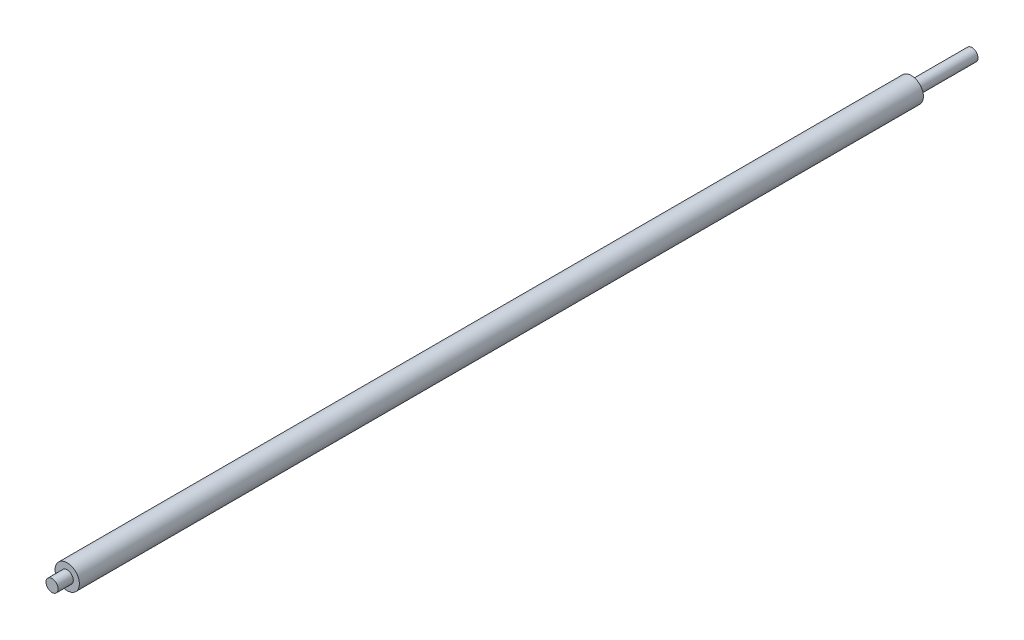
ISO-10303-21;
HEADER;
FILE_DESCRIPTION(('STEP AP214'),'2;1');
FILE_NAME('part.step','',(''),(''),'','','');
FILE_SCHEMA(('AUTOMOTIVE_DESIGN { 1 0 10303 214 1 1 1 1 }'));
ENDSEC;
DATA;
#1=APPLICATION_CONTEXT('core data for automotive mechanical design processes');
#2=APPLICATION_PROTOCOL_DEFINITION('international standard','automotive_design',2000,#1);
#3=PRODUCT_CONTEXT('',#1,'mechanical');
#4=PRODUCT('Part','Part','',(#3));
#5=PRODUCT_RELATED_PRODUCT_CATEGORY('part','',(#4));
#6=PRODUCT_DEFINITION_FORMATION('','',#4);
#7=PRODUCT_DEFINITION_CONTEXT('part definition',#1,'design');
#8=PRODUCT_DEFINITION('design','',#6,#7);
#9=PRODUCT_DEFINITION_SHAPE('','',#8);
#10=(LENGTH_UNIT() NAMED_UNIT(*) SI_UNIT(.MILLI.,.METRE.));
#11=(NAMED_UNIT(*) PLANE_ANGLE_UNIT() SI_UNIT($,.RADIAN.));
#12=(NAMED_UNIT(*) SI_UNIT($,.STERADIAN.) SOLID_ANGLE_UNIT());
#13=UNCERTAINTY_MEASURE_WITH_UNIT(LENGTH_MEASURE(1.E-05),#10,'distance_accuracy_value','');
#14=(GEOMETRIC_REPRESENTATION_CONTEXT(3) GLOBAL_UNCERTAINTY_ASSIGNED_CONTEXT((#13)) GLOBAL_UNIT_ASSIGNED_CONTEXT((#10,
#11,#12)) REPRESENTATION_CONTEXT('',''));
#15=CARTESIAN_POINT('',(0.,0.,0.));
#16=DIRECTION('',(0.,0.,1.));
#17=DIRECTION('',(1.,0.,0.));
#18=AXIS2_PLACEMENT_3D('',#15,#16,#17);
#19=CARTESIAN_POINT('',(0.,0.,-208.75));
#20=DIRECTION('',(0.,0.,1.));
#21=DIRECTION('',(1.,0.,0.));
#22=AXIS2_PLACEMENT_3D('',#19,#20,#21);
#23=PLANE('',#22);
#24=CARTESIAN_POINT('',(0.,0.,-208.75));
#25=DIRECTION('',(0.,0.,1.));
#26=DIRECTION('',(1.,0.,0.));
#27=AXIS2_PLACEMENT_3D('',#24,#25,#26);
#28=CIRCLE('',#27,6.);
#29=CARTESIAN_POINT('',(6.,0.,-208.75));
#30=VERTEX_POINT('',#29);
#31=EDGE_CURVE('E42',#30,#30,#28,.T.);
#32=ORIENTED_EDGE('',*,*,#31,.F.);
#33=EDGE_LOOP('',(#32));
#34=FACE_BOUND('',#33,.T.);
#35=CARTESIAN_POINT('',(0.,0.,-208.75));
#36=DIRECTION('',(0.,0.,1.));
#37=DIRECTION('',(1.,0.,0.));
#38=AXIS2_PLACEMENT_3D('',#35,#36,#37);
#39=CIRCLE('',#38,3.);
#40=CARTESIAN_POINT('',(3.,0.,-208.75));
#41=VERTEX_POINT('',#40);
#42=EDGE_CURVE('E10',#41,#41,#39,.F.);
#43=ORIENTED_EDGE('',*,*,#42,.F.);
#44=EDGE_LOOP('',(#43));
#45=FACE_BOUND('',#44,.T.);
#46=ADVANCED_FACE('F31',(#34,#45),#23,.F.);
#47=CARTESIAN_POINT('',(0.,0.,208.75));
#48=DIRECTION('',(0.,0.,1.));
#49=DIRECTION('',(1.,0.,0.));
#50=AXIS2_PLACEMENT_3D('',#47,#48,#49);
#51=PLANE('',#50);
#52=CARTESIAN_POINT('',(0.,0.,208.75));
#53=DIRECTION('',(0.,0.,1.));
#54=DIRECTION('',(1.,0.,0.));
#55=AXIS2_PLACEMENT_3D('',#52,#53,#54);
#56=CIRCLE('',#55,6.);
#57=CARTESIAN_POINT('',(6.,0.,208.75));
#58=VERTEX_POINT('',#57);
#59=EDGE_CURVE('E38',#58,#58,#56,.T.);
#60=ORIENTED_EDGE('',*,*,#59,.T.);
#61=EDGE_LOOP('',(#60));
#62=FACE_BOUND('',#61,.T.);
#63=CARTESIAN_POINT('',(0.,0.,208.75));
#64=DIRECTION('',(0.,0.,1.));
#65=DIRECTION('',(1.,0.,0.));
#66=AXIS2_PLACEMENT_3D('',#63,#64,#65);
#67=CIRCLE('',#66,3.);
#68=CARTESIAN_POINT('',(3.,0.,208.75));
#69=VERTEX_POINT('',#68);
#70=EDGE_CURVE('E49',#69,#69,#67,.T.);
#71=ORIENTED_EDGE('',*,*,#70,.F.);
#72=EDGE_LOOP('',(#71));
#73=FACE_BOUND('',#72,.T.);
#74=ADVANCED_FACE('F73',(#62,#73),#51,.T.);
#75=CARTESIAN_POINT('',(0.,0.,208.75));
#76=DIRECTION('',(0.,0.,-1.));
#77=DIRECTION('',(-1.,0.,0.));
#78=AXIS2_PLACEMENT_3D('',#75,#76,#77);
#79=CYLINDRICAL_SURFACE('',#78,6.);
#80=ORIENTED_EDGE('',*,*,#59,.F.);
#81=EDGE_LOOP('',(#80));
#82=FACE_BOUND('',#81,.T.);
#83=ORIENTED_EDGE('',*,*,#31,.T.);
#84=EDGE_LOOP('',(#83));
#85=FACE_BOUND('',#84,.T.);
#86=ADVANCED_FACE('F33',(#82,#85),#79,.T.);
#87=CARTESIAN_POINT('',(0.,0.,216.25));
#88=DIRECTION('',(0.,0.,-1.));
#89=DIRECTION('',(-1.,0.,0.));
#90=AXIS2_PLACEMENT_3D('',#87,#88,#89);
#91=CYLINDRICAL_SURFACE('',#90,3.);
#92=CARTESIAN_POINT('',(0.,0.,216.25));
#93=DIRECTION('',(0.,0.,1.));
#94=DIRECTION('',(1.,0.,0.));
#95=AXIS2_PLACEMENT_3D('',#92,#93,#94);
#96=CIRCLE('',#95,3.);
#97=CARTESIAN_POINT('',(3.,0.,216.25));
#98=VERTEX_POINT('',#97);
#99=EDGE_CURVE('E47',#98,#98,#96,.T.);
#100=ORIENTED_EDGE('',*,*,#99,.F.);
#101=EDGE_LOOP('',(#100));
#102=FACE_BOUND('',#101,.T.);
#103=ORIENTED_EDGE('',*,*,#70,.T.);
#104=EDGE_LOOP('',(#103));
#105=FACE_BOUND('',#104,.T.);
#106=ADVANCED_FACE('F69',(#102,#105),#91,.T.);
#107=CARTESIAN_POINT('',(0.,0.,216.25));
#108=DIRECTION('',(0.,0.,1.));
#109=DIRECTION('',(1.,0.,0.));
#110=AXIS2_PLACEMENT_3D('',#107,#108,#109);
#111=PLANE('',#110);
#112=ORIENTED_EDGE('',*,*,#99,.T.);
#113=EDGE_LOOP('',(#112));
#114=FACE_BOUND('',#113,.T.);
#115=ADVANCED_FACE('F62',(#114),#111,.T.);
#116=CARTESIAN_POINT('',(0.,0.,-238.75));
#117=DIRECTION('',(0.,0.,1.));
#118=DIRECTION('',(1.,0.,0.));
#119=AXIS2_PLACEMENT_3D('',#116,#117,#118);
#120=CYLINDRICAL_SURFACE('',#119,3.);
#121=CARTESIAN_POINT('',(0.,0.,-238.75));
#122=DIRECTION('',(0.,0.,-1.));
#123=DIRECTION('',(-1.,0.,0.));
#124=AXIS2_PLACEMENT_3D('',#121,#122,#123);
#125=CIRCLE('',#124,3.);
#126=CARTESIAN_POINT('',(-3.,0.,-238.75));
#127=VERTEX_POINT('',#126);
#128=EDGE_CURVE('E52',#127,#127,#125,.T.);
#129=ORIENTED_EDGE('',*,*,#128,.F.);
#130=EDGE_LOOP('',(#129));
#131=FACE_BOUND('',#130,.T.);
#132=ORIENTED_EDGE('',*,*,#42,.T.);
#133=EDGE_LOOP('',(#132));
#134=FACE_BOUND('',#133,.T.);
#135=ADVANCED_FACE('F60',(#131,#134),#120,.T.);
#136=CARTESIAN_POINT('',(0.,0.,-238.75));
#137=DIRECTION('',(0.,0.,-1.));
#138=DIRECTION('',(-1.,0.,0.));
#139=AXIS2_PLACEMENT_3D('',#136,#137,#138);
#140=PLANE('',#139);
#141=ORIENTED_EDGE('',*,*,#128,.T.);
#142=EDGE_LOOP('',(#141));
#143=FACE_BOUND('',#142,.T.);
#144=ADVANCED_FACE('F58',(#143),#140,.T.);
#145=CLOSED_SHELL('',(#46,#74,#86,#106,#115,#135,#144));
#146=MANIFOLD_SOLID_BREP('B2',#145);
#147=ADVANCED_BREP_SHAPE_REPRESENTATION('',(#18,#146),#14);
#148=SHAPE_DEFINITION_REPRESENTATION(#9,#147);
ENDSEC;
END-ISO-10303-21;
